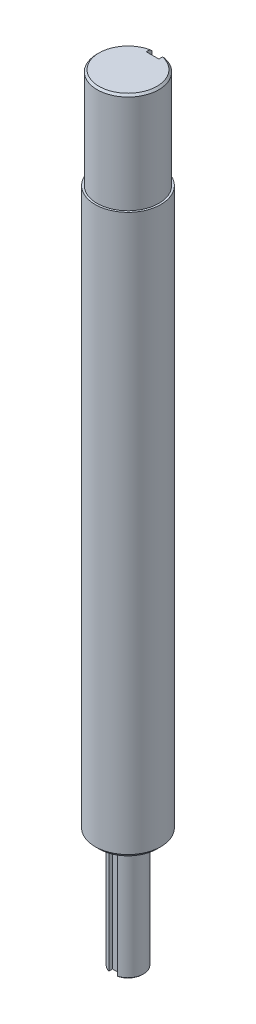
ISO-10303-21;
HEADER;
FILE_DESCRIPTION(('STEP AP214'),'2;1');
FILE_NAME('part.step','',(''),(''),'','','');
FILE_SCHEMA(('AUTOMOTIVE_DESIGN { 1 0 10303 214 1 1 1 1 }'));
ENDSEC;
DATA;
#1=APPLICATION_CONTEXT('core data for automotive mechanical design processes');
#2=APPLICATION_PROTOCOL_DEFINITION('international standard','automotive_design',2000,#1);
#3=PRODUCT_CONTEXT('',#1,'mechanical');
#4=PRODUCT('Part','Part','',(#3));
#5=PRODUCT_RELATED_PRODUCT_CATEGORY('part','',(#4));
#6=PRODUCT_DEFINITION_FORMATION('','',#4);
#7=PRODUCT_DEFINITION_CONTEXT('part definition',#1,'design');
#8=PRODUCT_DEFINITION('design','',#6,#7);
#9=PRODUCT_DEFINITION_SHAPE('','',#8);
#10=(LENGTH_UNIT() NAMED_UNIT(*) SI_UNIT(.MILLI.,.METRE.));
#11=(NAMED_UNIT(*) PLANE_ANGLE_UNIT() SI_UNIT($,.RADIAN.));
#12=(NAMED_UNIT(*) SI_UNIT($,.STERADIAN.) SOLID_ANGLE_UNIT());
#13=UNCERTAINTY_MEASURE_WITH_UNIT(LENGTH_MEASURE(1.E-05),#10,'distance_accuracy_value','');
#14=(GEOMETRIC_REPRESENTATION_CONTEXT(3) GLOBAL_UNCERTAINTY_ASSIGNED_CONTEXT((#13)) GLOBAL_UNIT_ASSIGNED_CONTEXT((#10,
#11,#12)) REPRESENTATION_CONTEXT('',''));
#15=CARTESIAN_POINT('',(0.,0.,0.));
#16=DIRECTION('',(0.,0.,1.));
#17=DIRECTION('',(1.,0.,0.));
#18=AXIS2_PLACEMENT_3D('',#15,#16,#17);
#19=CARTESIAN_POINT('',(0.,201.,0.));
#20=DIRECTION('',(0.,1.,0.));
#21=DIRECTION('',(-1.,0.,0.));
#22=AXIS2_PLACEMENT_3D('',#19,#20,#21);
#23=CYLINDRICAL_SURFACE('',#22,8.49999999999999);
#24=CARTESIAN_POINT('',(0.,31.,0.));
#25=DIRECTION('',(0.,-1.,0.));
#26=DIRECTION('',(1.,0.,0.));
#27=AXIS2_PLACEMENT_3D('',#24,#25,#26);
#28=CIRCLE('',#27,8.49999999999999);
#29=CARTESIAN_POINT('',(8.49999999999999,31.,0.));
#30=VERTEX_POINT('',#29);
#31=EDGE_CURVE('E251',#30,#30,#28,.F.);
#32=ORIENTED_EDGE('',*,*,#31,.T.);
#33=EDGE_LOOP('',(#32));
#34=FACE_BOUND('',#33,.T.);
#35=CARTESIAN_POINT('',(0.,175.,0.));
#36=DIRECTION('',(0.,1.,0.));
#37=DIRECTION('',(-1.,0.,0.));
#38=AXIS2_PLACEMENT_3D('',#35,#36,#37);
#39=CIRCLE('',#38,8.49999999999999);
#40=CARTESIAN_POINT('',(-8.5,175.,0.));
#41=VERTEX_POINT('',#40);
#42=EDGE_CURVE('E178',#41,#41,#39,.T.);
#43=ORIENTED_EDGE('',*,*,#42,.F.);
#44=EDGE_LOOP('',(#43));
#45=FACE_BOUND('',#44,.T.);
#46=ADVANCED_FACE('F35',(#34,#45),#23,.T.);
#47=CARTESIAN_POINT('',(0.,175.,0.));
#48=DIRECTION('',(0.,1.,0.));
#49=DIRECTION('',(-1.,0.,0.));
#50=AXIS2_PLACEMENT_3D('',#47,#48,#49);
#51=PLANE('',#50);
#52=ORIENTED_EDGE('',*,*,#42,.T.);
#53=EDGE_LOOP('',(#52));
#54=FACE_BOUND('',#53,.T.);
#55=DIRECTION('',(0.,0.,1.));
#56=VECTOR('',#55,1.);
#57=CARTESIAN_POINT('',(1.62499999999999,175.,-9.625));
#58=LINE('',#57,#56);
#59=CARTESIAN_POINT('',(1.62499999999999,175.,-7.83322251694665));
#60=VERTEX_POINT('',#59);
#61=CARTESIAN_POINT('',(1.62499999999999,175.,-6.375));
#62=VERTEX_POINT('',#61);
#63=EDGE_CURVE('E159',#60,#62,#58,.T.);
#64=ORIENTED_EDGE('',*,*,#63,.F.);
#65=CARTESIAN_POINT('',(0.,175.,0.));
#66=DIRECTION('',(0.,1.,0.));
#67=DIRECTION('',(-1.,0.,0.));
#68=AXIS2_PLACEMENT_3D('',#65,#66,#67);
#69=CIRCLE('',#68,8.);
#70=CARTESIAN_POINT('',(-1.625,175.,-7.83322251694665));
#71=VERTEX_POINT('',#70);
#72=EDGE_CURVE('E175',#71,#60,#69,.T.);
#73=ORIENTED_EDGE('',*,*,#72,.F.);
#74=DIRECTION('',(0.,0.,-1.));
#75=VECTOR('',#74,1.);
#76=CARTESIAN_POINT('',(-1.62500000000001,175.,-9.625));
#77=LINE('',#76,#75);
#78=CARTESIAN_POINT('',(-1.625,175.,-6.375));
#79=VERTEX_POINT('',#78);
#80=EDGE_CURVE('E154',#79,#71,#77,.T.);
#81=ORIENTED_EDGE('',*,*,#80,.F.);
#82=DIRECTION('',(-1.,0.,0.));
#83=VECTOR('',#82,1.);
#84=CARTESIAN_POINT('',(-1.625,175.,-6.375));
#85=LINE('',#84,#83);
#86=EDGE_CURVE('E156',#62,#79,#85,.T.);
#87=ORIENTED_EDGE('',*,*,#86,.F.);
#88=EDGE_LOOP('',(#64,#73,#81,#87));
#89=FACE_BOUND('',#88,.T.);
#90=ADVANCED_FACE('F214',(#54,#89),#51,.T.);
#91=CARTESIAN_POINT('',(0.,175.,0.));
#92=DIRECTION('',(0.,1.,0.));
#93=DIRECTION('',(-1.,0.,0.));
#94=AXIS2_PLACEMENT_3D('',#91,#92,#93);
#95=CYLINDRICAL_SURFACE('',#94,8.);
#96=DIRECTION('',(0.,1.,0.));
#97=VECTOR('',#96,1.);
#98=CARTESIAN_POINT('',(1.62499999999999,175.,-7.83322251694665));
#99=LINE('',#98,#97);
#100=CARTESIAN_POINT('',(1.62499999999999,200.5,-7.83322251694665));
#101=VERTEX_POINT('',#100);
#102=EDGE_CURVE('E173',#101,#60,#99,.F.);
#103=ORIENTED_EDGE('',*,*,#102,.F.);
#104=CARTESIAN_POINT('',(0.,200.5,0.));
#105=DIRECTION('',(0.,-1.,0.));
#106=DIRECTION('',(1.,0.,0.));
#107=AXIS2_PLACEMENT_3D('',#104,#105,#106);
#108=CIRCLE('',#107,8.);
#109=CARTESIAN_POINT('',(-1.62500000000001,200.5,-7.83322251694665));
#110=VERTEX_POINT('',#109);
#111=EDGE_CURVE('E194',#101,#110,#108,.T.);
#112=ORIENTED_EDGE('',*,*,#111,.T.);
#113=DIRECTION('',(0.,1.,0.));
#114=VECTOR('',#113,1.);
#115=CARTESIAN_POINT('',(-1.625,175.,-7.83322251694665));
#116=LINE('',#115,#114);
#117=EDGE_CURVE('E161',#71,#110,#116,.T.);
#118=ORIENTED_EDGE('',*,*,#117,.F.);
#119=ORIENTED_EDGE('',*,*,#72,.T.);
#120=EDGE_LOOP('',(#103,#112,#118,#119));
#121=FACE_BOUND('',#120,.T.);
#122=ADVANCED_FACE('F211',(#121),#95,.T.);
#123=CARTESIAN_POINT('',(8.49999999999998,201.,0.));
#124=DIRECTION('',(0.,-1.,0.));
#125=DIRECTION('',(1.,0.,0.));
#126=AXIS2_PLACEMENT_3D('',#123,#124,#125);
#127=PLANE('',#126);
#128=DIRECTION('',(0.,0.,-1.));
#129=VECTOR('',#128,1.);
#130=CARTESIAN_POINT('',(-1.625,201.,0.));
#131=LINE('',#130,#129);
#132=CARTESIAN_POINT('',(-1.62500000000001,201.,-6.375));
#133=VERTEX_POINT('',#132);
#134=CARTESIAN_POINT('',(-1.62500000000001,201.,-7.32184232280383));
#135=VERTEX_POINT('',#134);
#136=EDGE_CURVE('E181',#133,#135,#131,.T.);
#137=ORIENTED_EDGE('',*,*,#136,.T.);
#138=CARTESIAN_POINT('',(0.,201.,0.));
#139=DIRECTION('',(0.,-1.,0.));
#140=DIRECTION('',(1.,0.,0.));
#141=AXIS2_PLACEMENT_3D('',#138,#139,#140);
#142=CIRCLE('',#141,7.50000000000009);
#143=CARTESIAN_POINT('',(1.62499999999999,201.,-7.32184232280383));
#144=VERTEX_POINT('',#143);
#145=EDGE_CURVE('E184',#135,#144,#142,.F.);
#146=ORIENTED_EDGE('',*,*,#145,.T.);
#147=DIRECTION('',(0.,0.,-1.));
#148=VECTOR('',#147,1.);
#149=CARTESIAN_POINT('',(1.62499999999999,201.,-9.625));
#150=LINE('',#149,#148);
#151=CARTESIAN_POINT('',(1.62499999999999,201.,-6.375));
#152=VERTEX_POINT('',#151);
#153=EDGE_CURVE('E153',#152,#144,#150,.T.);
#154=ORIENTED_EDGE('',*,*,#153,.F.);
#155=DIRECTION('',(1.,0.,0.));
#156=VECTOR('',#155,1.);
#157=CARTESIAN_POINT('',(-1.62500000000001,201.,-6.375));
#158=LINE('',#157,#156);
#159=EDGE_CURVE('E164',#133,#152,#158,.T.);
#160=ORIENTED_EDGE('',*,*,#159,.F.);
#161=EDGE_LOOP('',(#137,#146,#154,#160));
#162=FACE_BOUND('',#161,.T.);
#163=ADVANCED_FACE('F206',(#162),#127,.F.);
#164=CARTESIAN_POINT('',(1.62499999999999,170.403805922287,-9.625));
#165=DIRECTION('',(1.,0.,0.));
#166=DIRECTION('',(0.,0.,-1.));
#167=AXIS2_PLACEMENT_3D('',#164,#165,#166);
#168=PLANE('',#167);
#169=ORIENTED_EDGE('',*,*,#153,.T.);
#170=CARTESIAN_POINT('',(1.62499999999999,201.,-7.32184232280383));
#171=CARTESIAN_POINT('',(1.62499999999999,200.916729938829,-7.40713422001277));
#172=CARTESIAN_POINT('',(1.62499999999999,200.833428241391,-7.49239518498508));
#173=CARTESIAN_POINT('',(1.62499999999999,200.666761574724,-7.66285524969881));
#174=CARTESIAN_POINT('',(1.62499999999999,200.583396605495,-7.74805434944077));
#175=CARTESIAN_POINT('',(1.62499999999999,200.5,-7.83322251694665));
#176=B_SPLINE_CURVE_WITH_KNOTS('',3,(#170,#171,#172,#173,#174,#175),.UNSPECIFIED.,.F.,.F.,(4,2,
4),(0.,0.357599558858819,0.71519911453882),.UNSPECIFIED.);
#177=EDGE_CURVE('E187',#144,#101,#176,.T.);
#178=ORIENTED_EDGE('',*,*,#177,.T.);
#179=ORIENTED_EDGE('',*,*,#102,.T.);
#180=ORIENTED_EDGE('',*,*,#63,.T.);
#181=DIRECTION('',(0.,1.,0.));
#182=VECTOR('',#181,1.);
#183=CARTESIAN_POINT('',(1.62499999999999,170.403805922287,-6.375));
#184=LINE('',#183,#182);
#185=EDGE_CURVE('E157',#62,#152,#184,.T.);
#186=ORIENTED_EDGE('',*,*,#185,.T.);
#187=EDGE_LOOP('',(#169,#178,#179,#180,#186));
#188=FACE_BOUND('',#187,.T.);
#189=ADVANCED_FACE('F200',(#188),#168,.F.);
#190=CARTESIAN_POINT('',(-1.625,170.403805922287,-6.375));
#191=DIRECTION('',(0.,0.,1.));
#192=DIRECTION('',(1.,0.,0.));
#193=AXIS2_PLACEMENT_3D('',#190,#191,#192);
#194=PLANE('',#193);
#195=ORIENTED_EDGE('',*,*,#86,.T.);
#196=DIRECTION('',(0.,1.,0.));
#197=VECTOR('',#196,1.);
#198=CARTESIAN_POINT('',(-1.625,170.403805922287,-6.375));
#199=LINE('',#198,#197);
#200=EDGE_CURVE('E167',#79,#133,#199,.T.);
#201=ORIENTED_EDGE('',*,*,#200,.T.);
#202=ORIENTED_EDGE('',*,*,#159,.T.);
#203=ORIENTED_EDGE('',*,*,#185,.F.);
#204=EDGE_LOOP('',(#195,#201,#202,#203));
#205=FACE_BOUND('',#204,.T.);
#206=ADVANCED_FACE('F205',(#205),#194,.F.);
#207=CARTESIAN_POINT('',(-1.625,170.403805922287,-9.625));
#208=DIRECTION('',(-1.,0.,0.));
#209=DIRECTION('',(0.,0.,1.));
#210=AXIS2_PLACEMENT_3D('',#207,#208,#209);
#211=PLANE('',#210);
#212=ORIENTED_EDGE('',*,*,#117,.T.);
#213=CARTESIAN_POINT('',(-1.62500000000001,200.5,-7.83322251694665));
#214=CARTESIAN_POINT('',(-1.62500000000001,200.583396605495,-7.74805434944077));
#215=CARTESIAN_POINT('',(-1.62500000000001,200.666761574724,-7.66285524969881));
#216=CARTESIAN_POINT('',(-1.62500000000001,200.833428241391,-7.49239518498508));
#217=CARTESIAN_POINT('',(-1.62500000000001,200.916729938829,-7.40713422001277));
#218=CARTESIAN_POINT('',(-1.62500000000001,201.,-7.32184232280382));
#219=B_SPLINE_CURVE_WITH_KNOTS('',3,(#213,#214,#215,#216,#217,#218),.UNSPECIFIED.,.F.,.F.,(4,2,
4),(0.,0.357599555680017,0.715199114538818),.UNSPECIFIED.);
#220=EDGE_CURVE('E239',#110,#135,#219,.T.);
#221=ORIENTED_EDGE('',*,*,#220,.T.);
#222=ORIENTED_EDGE('',*,*,#136,.F.);
#223=ORIENTED_EDGE('',*,*,#200,.F.);
#224=ORIENTED_EDGE('',*,*,#80,.T.);
#225=EDGE_LOOP('',(#212,#221,#222,#223,#224));
#226=FACE_BOUND('',#225,.T.);
#227=ADVANCED_FACE('F208',(#226),#211,.F.);
#228=CARTESIAN_POINT('',(0.,201.,0.));
#229=DIRECTION('',(0.,-1.,0.));
#230=DIRECTION('',(1.,0.,0.));
#231=AXIS2_PLACEMENT_3D('',#228,#229,#230);
#232=CONICAL_SURFACE('',#231,7.50000000000009,0.785398163397443);
#233=ORIENTED_EDGE('',*,*,#220,.F.);
#234=ORIENTED_EDGE('',*,*,#111,.F.);
#235=ORIENTED_EDGE('',*,*,#177,.F.);
#236=ORIENTED_EDGE('',*,*,#145,.F.);
#237=EDGE_LOOP('',(#233,#234,#235,#236));
#238=FACE_BOUND('',#237,.T.);
#239=ADVANCED_FACE('F196',(#238),#232,.T.);
#240=CARTESIAN_POINT('',(0.,30.,0.));
#241=DIRECTION('',(0.,-1.,0.));
#242=DIRECTION('',(1.,0.,0.));
#243=AXIS2_PLACEMENT_3D('',#240,#241,#242);
#244=PLANE('',#243);
#245=CARTESIAN_POINT('',(0.,30.,0.));
#246=DIRECTION('',(0.,-1.,0.));
#247=DIRECTION('',(1.,0.,0.));
#248=AXIS2_PLACEMENT_3D('',#245,#246,#247);
#249=CIRCLE('',#248,4.);
#250=CARTESIAN_POINT('',(-1.12499999999999,30.,3.83853813319602));
#251=VERTEX_POINT('',#250);
#252=CARTESIAN_POINT('',(1.12500000000001,30.,3.83853813319602));
#253=VERTEX_POINT('',#252);
#254=EDGE_CURVE('E133',#251,#253,#249,.T.);
#255=ORIENTED_EDGE('',*,*,#254,.F.);
#256=DIRECTION('',(0.,0.,1.));
#257=VECTOR('',#256,1.);
#258=CARTESIAN_POINT('',(-1.12499999999999,30.,5.125));
#259=LINE('',#258,#257);
#260=CARTESIAN_POINT('',(-1.12499999999999,30.,2.875));
#261=VERTEX_POINT('',#260);
#262=EDGE_CURVE('E127',#261,#251,#259,.T.);
#263=ORIENTED_EDGE('',*,*,#262,.F.);
#264=DIRECTION('',(-1.,0.,0.));
#265=VECTOR('',#264,1.);
#266=CARTESIAN_POINT('',(-1.12499999999999,30.,2.875));
#267=LINE('',#266,#265);
#268=CARTESIAN_POINT('',(1.12500000000001,30.,2.875));
#269=VERTEX_POINT('',#268);
#270=EDGE_CURVE('E118',#269,#261,#267,.T.);
#271=ORIENTED_EDGE('',*,*,#270,.F.);
#272=DIRECTION('',(0.,0.,-1.));
#273=VECTOR('',#272,1.);
#274=CARTESIAN_POINT('',(1.12500000000001,30.,5.125));
#275=LINE('',#274,#273);
#276=EDGE_CURVE('E126',#253,#269,#275,.T.);
#277=ORIENTED_EDGE('',*,*,#276,.F.);
#278=EDGE_LOOP('',(#255,#263,#271,#277));
#279=FACE_BOUND('',#278,.T.);
#280=CARTESIAN_POINT('',(0.,30.,0.));
#281=DIRECTION('',(0.,-1.,0.));
#282=DIRECTION('',(1.,0.,0.));
#283=AXIS2_PLACEMENT_3D('',#280,#281,#282);
#284=CIRCLE('',#283,7.49999999999998);
#285=CARTESIAN_POINT('',(7.49999999999998,30.,0.));
#286=VERTEX_POINT('',#285);
#287=EDGE_CURVE('E249',#286,#286,#284,.T.);
#288=ORIENTED_EDGE('',*,*,#287,.T.);
#289=EDGE_LOOP('',(#288));
#290=FACE_BOUND('',#289,.T.);
#291=ADVANCED_FACE('F130',(#279,#290),#244,.T.);
#292=CARTESIAN_POINT('',(0.,30.,0.));
#293=DIRECTION('',(0.,-1.,0.));
#294=DIRECTION('',(1.,0.,0.));
#295=AXIS2_PLACEMENT_3D('',#292,#293,#294);
#296=CYLINDRICAL_SURFACE('',#295,4.);
#297=DIRECTION('',(0.,-1.,0.));
#298=VECTOR('',#297,1.);
#299=CARTESIAN_POINT('',(1.12500000000001,30.,3.83853813319602));
#300=LINE('',#299,#298);
#301=CARTESIAN_POINT('',(1.12500000000001,0.200000000000023,3.83853813319602));
#302=VERTEX_POINT('',#301);
#303=EDGE_CURVE('E150',#302,#253,#300,.F.);
#304=ORIENTED_EDGE('',*,*,#303,.F.);
#305=CARTESIAN_POINT('',(0.,0.200000000000023,0.));
#306=DIRECTION('',(0.,1.,0.));
#307=DIRECTION('',(-1.,0.,0.));
#308=AXIS2_PLACEMENT_3D('',#305,#306,#307);
#309=CIRCLE('',#308,4.);
#310=CARTESIAN_POINT('',(-1.12499999999999,0.200000000000023,3.83853813319602));
#311=VERTEX_POINT('',#310);
#312=EDGE_CURVE('E12',#302,#311,#309,.T.);
#313=ORIENTED_EDGE('',*,*,#312,.T.);
#314=DIRECTION('',(0.,-1.,0.));
#315=VECTOR('',#314,1.);
#316=CARTESIAN_POINT('',(-1.12499999999999,30.,3.83853813319602));
#317=LINE('',#316,#315);
#318=EDGE_CURVE('E148',#251,#311,#317,.T.);
#319=ORIENTED_EDGE('',*,*,#318,.F.);
#320=ORIENTED_EDGE('',*,*,#254,.T.);
#321=EDGE_LOOP('',(#304,#313,#319,#320));
#322=FACE_BOUND('',#321,.T.);
#323=ADVANCED_FACE('F223',(#322),#296,.T.);
#324=CARTESIAN_POINT('',(8.5,0.,0.));
#325=DIRECTION('',(0.,1.,0.));
#326=DIRECTION('',(-1.,0.,0.));
#327=AXIS2_PLACEMENT_3D('',#324,#325,#326);
#328=PLANE('',#327);
#329=DIRECTION('',(-1.,0.,0.));
#330=VECTOR('',#329,1.);
#331=CARTESIAN_POINT('',(8.5,0.,2.675));
#332=LINE('',#331,#330);
#333=CARTESIAN_POINT('',(1.32500000000001,0.,2.675));
#334=VERTEX_POINT('',#333);
#335=CARTESIAN_POINT('',(-1.32499999999999,0.,2.675));
#336=VERTEX_POINT('',#335);
#337=EDGE_CURVE('E263',#334,#336,#332,.T.);
#338=ORIENTED_EDGE('',*,*,#337,.T.);
#339=DIRECTION('',(0.,0.,1.));
#340=VECTOR('',#339,1.);
#341=CARTESIAN_POINT('',(-1.32499999999999,0.,0.));
#342=LINE('',#341,#340);
#343=CARTESIAN_POINT('',(-1.32499999999998,0.,3.56151302117513));
#344=VERTEX_POINT('',#343);
#345=EDGE_CURVE('E265',#336,#344,#342,.T.);
#346=ORIENTED_EDGE('',*,*,#345,.T.);
#347=CARTESIAN_POINT('',(0.,0.,0.));
#348=DIRECTION('',(0.,1.,0.));
#349=DIRECTION('',(-1.,0.,0.));
#350=AXIS2_PLACEMENT_3D('',#347,#348,#349);
#351=CIRCLE('',#350,3.8);
#352=CARTESIAN_POINT('',(1.32499999999999,0.,3.56151302117513));
#353=VERTEX_POINT('',#352);
#354=EDGE_CURVE('E259',#344,#353,#351,.F.);
#355=ORIENTED_EDGE('',*,*,#354,.T.);
#356=DIRECTION('',(0.,0.,-1.));
#357=VECTOR('',#356,1.);
#358=CARTESIAN_POINT('',(1.32500000000001,0.,0.));
#359=LINE('',#358,#357);
#360=EDGE_CURVE('E261',#353,#334,#359,.T.);
#361=ORIENTED_EDGE('',*,*,#360,.T.);
#362=EDGE_LOOP('',(#338,#346,#355,#361));
#363=FACE_BOUND('',#362,.T.);
#364=ADVANCED_FACE('F219',(#363),#328,.F.);
#365=CARTESIAN_POINT('',(0.,30.,0.));
#366=DIRECTION('',(0.,1.,0.));
#367=DIRECTION('',(-1.,0.,0.));
#368=AXIS2_PLACEMENT_3D('',#365,#366,#367);
#369=CONICAL_SURFACE('',#368,7.49999999999998,0.785398163397441);
#370=ORIENTED_EDGE('',*,*,#31,.F.);
#371=EDGE_LOOP('',(#370));
#372=FACE_BOUND('',#371,.T.);
#373=ORIENTED_EDGE('',*,*,#287,.F.);
#374=EDGE_LOOP('',(#373));
#375=FACE_BOUND('',#374,.T.);
#376=ADVANCED_FACE('F222',(#372,#375),#369,.T.);
#377=CARTESIAN_POINT('',(1.12500000000001,33.1819805153395,5.125));
#378=DIRECTION('',(1.,0.,0.));
#379=DIRECTION('',(0.,0.,-1.));
#380=AXIS2_PLACEMENT_3D('',#377,#378,#379);
#381=PLANE('',#380);
#382=DIRECTION('',(0.,-1.,0.));
#383=VECTOR('',#382,1.);
#384=CARTESIAN_POINT('',(1.12500000000001,33.1819805153395,2.875));
#385=LINE('',#384,#383);
#386=CARTESIAN_POINT('',(1.12500000000001,0.20000000000002,2.875));
#387=VERTEX_POINT('',#386);
#388=EDGE_CURVE('E123',#269,#387,#385,.T.);
#389=ORIENTED_EDGE('',*,*,#388,.T.);
#390=DIRECTION('',(0.,0.,1.));
#391=VECTOR('',#390,1.);
#392=CARTESIAN_POINT('',(1.12500000000001,0.20000000000002,5.125));
#393=LINE('',#392,#391);
#394=EDGE_CURVE('E44',#387,#302,#393,.T.);
#395=ORIENTED_EDGE('',*,*,#394,.T.);
#396=ORIENTED_EDGE('',*,*,#303,.T.);
#397=ORIENTED_EDGE('',*,*,#276,.T.);
#398=EDGE_LOOP('',(#389,#395,#396,#397));
#399=FACE_BOUND('',#398,.T.);
#400=ADVANCED_FACE('F305',(#399),#381,.F.);
#401=CARTESIAN_POINT('',(-1.12499999999999,33.1819805153395,2.875));
#402=DIRECTION('',(0.,0.,-1.));
#403=DIRECTION('',(-1.,0.,0.));
#404=AXIS2_PLACEMENT_3D('',#401,#402,#403);
#405=PLANE('',#404);
#406=DIRECTION('',(0.,-1.,0.));
#407=VECTOR('',#406,1.);
#408=CARTESIAN_POINT('',(-1.12499999999999,33.1819805153395,2.875));
#409=LINE('',#408,#407);
#410=CARTESIAN_POINT('',(-1.12499999999999,0.20000000000002,2.875));
#411=VERTEX_POINT('',#410);
#412=EDGE_CURVE('E122',#261,#411,#409,.T.);
#413=ORIENTED_EDGE('',*,*,#412,.T.);
#414=DIRECTION('',(1.,0.,0.));
#415=VECTOR('',#414,1.);
#416=CARTESIAN_POINT('',(-1.12499999999999,0.20000000000002,2.875));
#417=LINE('',#416,#415);
#418=EDGE_CURVE('E59',#411,#387,#417,.T.);
#419=ORIENTED_EDGE('',*,*,#418,.T.);
#420=ORIENTED_EDGE('',*,*,#388,.F.);
#421=ORIENTED_EDGE('',*,*,#270,.T.);
#422=EDGE_LOOP('',(#413,#419,#420,#421));
#423=FACE_BOUND('',#422,.T.);
#424=ADVANCED_FACE('F120',(#423),#405,.F.);
#425=CARTESIAN_POINT('',(-1.12499999999999,33.1819805153395,5.125));
#426=DIRECTION('',(-1.,0.,0.));
#427=DIRECTION('',(0.,0.,1.));
#428=AXIS2_PLACEMENT_3D('',#425,#426,#427);
#429=PLANE('',#428);
#430=ORIENTED_EDGE('',*,*,#318,.T.);
#431=DIRECTION('',(0.,0.,-1.));
#432=VECTOR('',#431,1.);
#433=CARTESIAN_POINT('',(-1.12499999999999,0.20000000000002,5.125));
#434=LINE('',#433,#432);
#435=EDGE_CURVE('E141',#311,#411,#434,.T.);
#436=ORIENTED_EDGE('',*,*,#435,.T.);
#437=ORIENTED_EDGE('',*,*,#412,.F.);
#438=ORIENTED_EDGE('',*,*,#262,.T.);
#439=EDGE_LOOP('',(#430,#436,#437,#438));
#440=FACE_BOUND('',#439,.T.);
#441=ADVANCED_FACE('F139',(#440),#429,.F.);
#442=CARTESIAN_POINT('',(1.12500000000001,0.20000000000002,5.125));
#443=DIRECTION('',(0.707106781186578,0.707106781186517,0.));
#444=DIRECTION('',(0.,0.,1.));
#445=AXIS2_PLACEMENT_3D('',#442,#443,#444);
#446=PLANE('',#445);
#447=CARTESIAN_POINT('',(1.12500000000001,0.200000000000021,3.83853813319602));
#448=CARTESIAN_POINT('',(1.15894416236955,0.166055837630473,3.79324947663778));
#449=CARTESIAN_POINT('',(1.19258287347797,0.132417126522053,3.74751977519123));
#450=CARTESIAN_POINT('',(1.2592495428885,0.0657504571115163,3.65517807514618));
#451=CARTESIAN_POINT('',(1.29227749844674,0.0327225015532681,3.60856607258577));
#452=CARTESIAN_POINT('',(1.32499999999999,0.,3.56151302117515));
#453=B_SPLINE_CURVE_WITH_KNOTS('',3,(#447,#448,#449,#450,#451,#452),.UNSPECIFIED.,.F.,.F.,(4,2,
4),(0.,0.197962072832527,0.395925034809419),.UNSPECIFIED.);
#454=EDGE_CURVE('E145',#302,#353,#453,.T.);
#455=ORIENTED_EDGE('',*,*,#454,.F.);
#456=ORIENTED_EDGE('',*,*,#394,.F.);
#457=DIRECTION('',(0.57735026918961,-0.57735026918966,-0.577350269189608));
#458=VECTOR('',#457,1.);
#459=CARTESIAN_POINT('',(0.375000000000049,0.950000000000043,3.62499999999995));
#460=LINE('',#459,#458);
#461=EDGE_CURVE('E39',#334,#387,#460,.F.);
#462=ORIENTED_EDGE('',*,*,#461,.F.);
#463=ORIENTED_EDGE('',*,*,#360,.F.);
#464=EDGE_LOOP('',(#455,#456,#462,#463));
#465=FACE_BOUND('',#464,.T.);
#466=ADVANCED_FACE('F285',(#465),#446,.F.);
#467=CARTESIAN_POINT('',(-1.12499999999999,0.20000000000002,2.875));
#468=DIRECTION('',(0.,0.707106781186516,-0.707106781186579));
#469=DIRECTION('',(1.,0.,0.));
#470=AXIS2_PLACEMENT_3D('',#467,#468,#469);
#471=PLANE('',#470);
#472=ORIENTED_EDGE('',*,*,#461,.T.);
#473=ORIENTED_EDGE('',*,*,#418,.F.);
#474=DIRECTION('',(-0.577350269189608,-0.577350269189661,-0.577350269189609));
#475=VECTOR('',#474,1.);
#476=CARTESIAN_POINT('',(-2.21666666666661,-0.891666666666694,1.78333333333338));
#477=LINE('',#476,#475);
#478=EDGE_CURVE('E278',#336,#411,#477,.F.);
#479=ORIENTED_EDGE('',*,*,#478,.F.);
#480=ORIENTED_EDGE('',*,*,#337,.F.);
#481=EDGE_LOOP('',(#472,#473,#479,#480));
#482=FACE_BOUND('',#481,.T.);
#483=ADVANCED_FACE('F37',(#482),#471,.F.);
#484=CARTESIAN_POINT('',(0.,0.,0.));
#485=DIRECTION('',(0.,1.,0.));
#486=DIRECTION('',(-1.,0.,0.));
#487=AXIS2_PLACEMENT_3D('',#484,#485,#486);
#488=CONICAL_SURFACE('',#487,3.8,0.785398163397396);
#489=ORIENTED_EDGE('',*,*,#454,.T.);
#490=ORIENTED_EDGE('',*,*,#354,.F.);
#491=CARTESIAN_POINT('',(-1.325,0.,3.56151302117517));
#492=CARTESIAN_POINT('',(-1.29227749844674,0.0327225015532601,3.60856607258578));
#493=CARTESIAN_POINT('',(-1.25924954288849,0.0657504571115138,3.65517807514619));
#494=CARTESIAN_POINT('',(-1.19258287347795,0.132417126522055,3.74751977519123));
#495=CARTESIAN_POINT('',(-1.15894416236953,0.166055837630475,3.79324947663777));
#496=CARTESIAN_POINT('',(-1.12499999999999,0.200000000000021,3.83853813319602));
#497=B_SPLINE_CURVE_WITH_KNOTS('',3,(#491,#492,#493,#494,#495,#496),.UNSPECIFIED.,.F.,.F.,(4,2,
4),(0.,0.197962961976891,0.395925034809418),.UNSPECIFIED.);
#498=EDGE_CURVE('E271',#311,#344,#497,.F.);
#499=ORIENTED_EDGE('',*,*,#498,.F.);
#500=ORIENTED_EDGE('',*,*,#312,.F.);
#501=EDGE_LOOP('',(#489,#490,#499,#500));
#502=FACE_BOUND('',#501,.T.);
#503=ADVANCED_FACE('F279',(#502),#488,.T.);
#504=CARTESIAN_POINT('',(-1.32499999999999,0.,0.));
#505=DIRECTION('',(-0.70710678118658,0.707106781186515,0.));
#506=DIRECTION('',(0.,0.,1.));
#507=AXIS2_PLACEMENT_3D('',#504,#505,#506);
#508=PLANE('',#507);
#509=ORIENTED_EDGE('',*,*,#478,.T.);
#510=ORIENTED_EDGE('',*,*,#435,.F.);
#511=ORIENTED_EDGE('',*,*,#498,.T.);
#512=ORIENTED_EDGE('',*,*,#345,.F.);
#513=EDGE_LOOP('',(#509,#510,#511,#512));
#514=FACE_BOUND('',#513,.T.);
#515=ADVANCED_FACE('F281',(#514),#508,.F.);
#516=CLOSED_SHELL('',(#46,#90,#122,#163,#189,#206,#227,#239,#291,#323,#364,#376,#400,#424,#441,
#466,#483,#503,#515));
#517=MANIFOLD_SOLID_BREP('B2',#516);
#518=ADVANCED_BREP_SHAPE_REPRESENTATION('',(#18,#517),#14);
#519=SHAPE_DEFINITION_REPRESENTATION(#9,#518);
ENDSEC;
END-ISO-10303-21;
